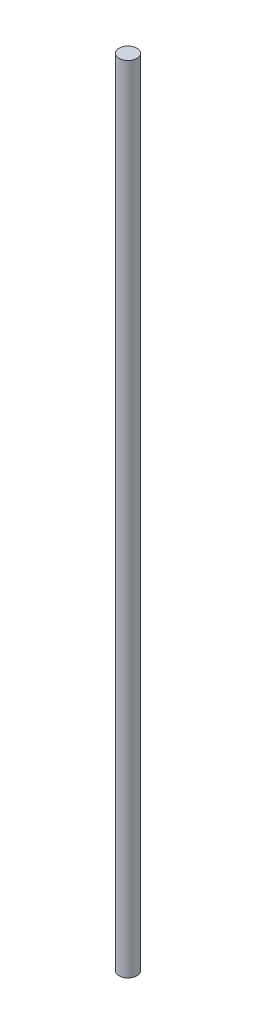
ISO-10303-21;
HEADER;
FILE_DESCRIPTION(('STEP AP214'),'2;1');
FILE_NAME('part.step','',(''),(''),'','','');
FILE_SCHEMA(('AUTOMOTIVE_DESIGN { 1 0 10303 214 1 1 1 1 }'));
ENDSEC;
DATA;
#1=APPLICATION_CONTEXT('core data for automotive mechanical design processes');
#2=APPLICATION_PROTOCOL_DEFINITION('international standard','automotive_design',2000,#1);
#3=PRODUCT_CONTEXT('',#1,'mechanical');
#4=PRODUCT('Part','Part','',(#3));
#5=PRODUCT_RELATED_PRODUCT_CATEGORY('part','',(#4));
#6=PRODUCT_DEFINITION_FORMATION('','',#4);
#7=PRODUCT_DEFINITION_CONTEXT('part definition',#1,'design');
#8=PRODUCT_DEFINITION('design','',#6,#7);
#9=PRODUCT_DEFINITION_SHAPE('','',#8);
#10=(LENGTH_UNIT() NAMED_UNIT(*) SI_UNIT(.MILLI.,.METRE.));
#11=(NAMED_UNIT(*) PLANE_ANGLE_UNIT() SI_UNIT($,.RADIAN.));
#12=(NAMED_UNIT(*) SI_UNIT($,.STERADIAN.) SOLID_ANGLE_UNIT());
#13=UNCERTAINTY_MEASURE_WITH_UNIT(LENGTH_MEASURE(1.E-05),#10,'distance_accuracy_value','');
#14=(GEOMETRIC_REPRESENTATION_CONTEXT(3) GLOBAL_UNCERTAINTY_ASSIGNED_CONTEXT((#13)) GLOBAL_UNIT_ASSIGNED_CONTEXT((#10,
#11,#12)) REPRESENTATION_CONTEXT('',''));
#15=CARTESIAN_POINT('',(0.,0.,0.));
#16=DIRECTION('',(0.,0.,1.));
#17=DIRECTION('',(1.,0.,0.));
#18=AXIS2_PLACEMENT_3D('',#15,#16,#17);
#19=CARTESIAN_POINT('',(0.,536.,0.));
#20=DIRECTION('',(0.,-1.,0.));
#21=DIRECTION('',(0.,0.,-1.));
#22=AXIS2_PLACEMENT_3D('',#19,#20,#21);
#23=CYLINDRICAL_SURFACE('',#22,6.);
#24=CARTESIAN_POINT('',(0.,536.,0.));
#25=DIRECTION('',(0.,1.,0.));
#26=DIRECTION('',(0.,0.,1.));
#27=AXIS2_PLACEMENT_3D('',#24,#25,#26);
#28=CIRCLE('',#27,6.);
#29=CARTESIAN_POINT('',(0.,536.,6.));
#30=VERTEX_POINT('',#29);
#31=EDGE_CURVE('E10',#30,#30,#28,.T.);
#32=ORIENTED_EDGE('',*,*,#31,.F.);
#33=EDGE_LOOP('',(#32));
#34=FACE_BOUND('',#33,.T.);
#35=CARTESIAN_POINT('',(0.,0.,0.));
#36=DIRECTION('',(0.,1.,0.));
#37=DIRECTION('',(0.,0.,1.));
#38=AXIS2_PLACEMENT_3D('',#35,#36,#37);
#39=CIRCLE('',#38,6.);
#40=CARTESIAN_POINT('',(0.,0.,6.));
#41=VERTEX_POINT('',#40);
#42=EDGE_CURVE('E49',#41,#41,#39,.T.);
#43=ORIENTED_EDGE('',*,*,#42,.T.);
#44=EDGE_LOOP('',(#43));
#45=FACE_BOUND('',#44,.T.);
#46=ADVANCED_FACE('F46',(#34,#45),#23,.T.);
#47=CARTESIAN_POINT('',(0.,536.,0.));
#48=DIRECTION('',(0.,1.,0.));
#49=DIRECTION('',(0.,0.,1.));
#50=AXIS2_PLACEMENT_3D('',#47,#48,#49);
#51=PLANE('',#50);
#52=ORIENTED_EDGE('',*,*,#31,.T.);
#53=EDGE_LOOP('',(#52));
#54=FACE_BOUND('',#53,.T.);
#55=ADVANCED_FACE('F61',(#54),#51,.T.);
#56=CARTESIAN_POINT('',(0.,0.,0.));
#57=DIRECTION('',(0.,1.,0.));
#58=DIRECTION('',(0.,0.,1.));
#59=AXIS2_PLACEMENT_3D('',#56,#57,#58);
#60=PLANE('',#59);
#61=ORIENTED_EDGE('',*,*,#42,.F.);
#62=EDGE_LOOP('',(#61));
#63=FACE_BOUND('',#62,.T.);
#64=ADVANCED_FACE('F59',(#63),#60,.F.);
#65=CLOSED_SHELL('',(#46,#55,#64));
#66=MANIFOLD_SOLID_BREP('B2',#65);
#67=ADVANCED_BREP_SHAPE_REPRESENTATION('',(#18,#66),#14);
#68=SHAPE_DEFINITION_REPRESENTATION(#9,#67);
ENDSEC;
END-ISO-10303-21;
